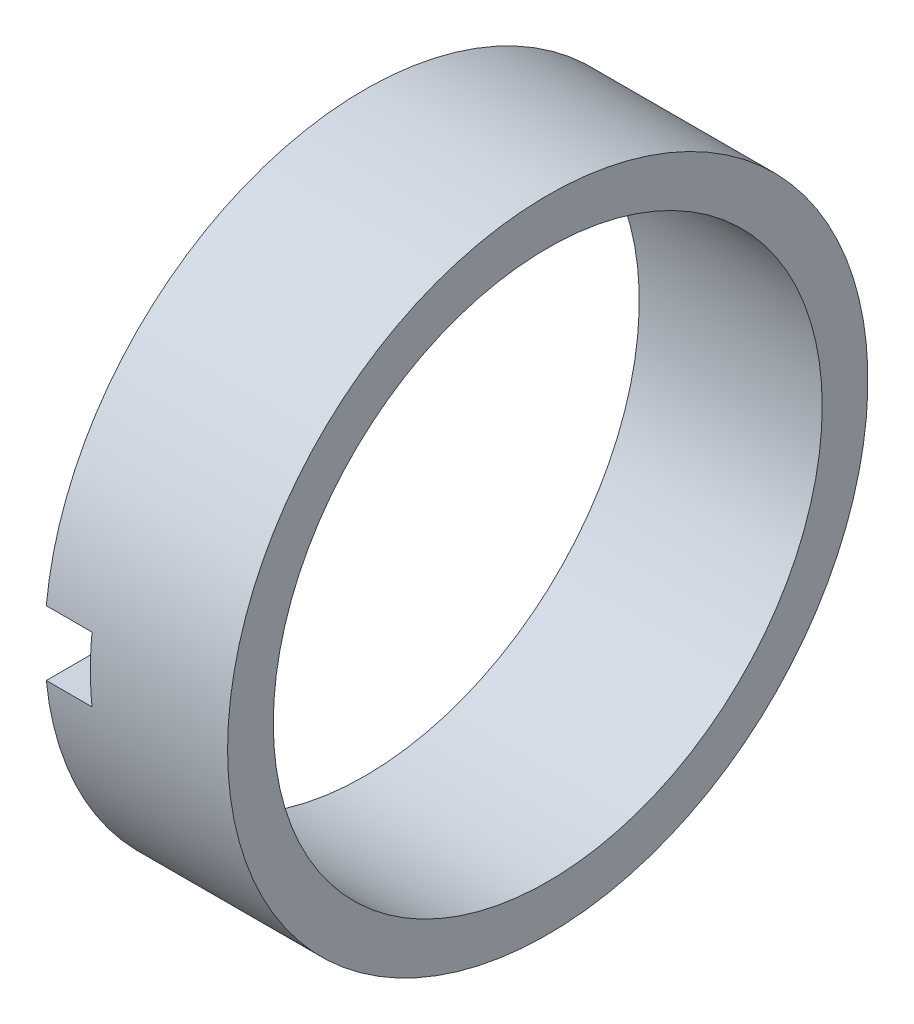
ISO-10303-21;
HEADER;
FILE_DESCRIPTION(('STEP AP214'),'2;1');
FILE_NAME('part.step','',(''),(''),'','','');
FILE_SCHEMA(('AUTOMOTIVE_DESIGN { 1 0 10303 214 1 1 1 1 }'));
ENDSEC;
DATA;
#1=APPLICATION_CONTEXT('core data for automotive mechanical design processes');
#2=APPLICATION_PROTOCOL_DEFINITION('international standard','automotive_design',2000,#1);
#3=PRODUCT_CONTEXT('',#1,'mechanical');
#4=PRODUCT('Part','Part','',(#3));
#5=PRODUCT_RELATED_PRODUCT_CATEGORY('part','',(#4));
#6=PRODUCT_DEFINITION_FORMATION('','',#4);
#7=PRODUCT_DEFINITION_CONTEXT('part definition',#1,'design');
#8=PRODUCT_DEFINITION('design','',#6,#7);
#9=PRODUCT_DEFINITION_SHAPE('','',#8);
#10=(LENGTH_UNIT() NAMED_UNIT(*) SI_UNIT(.MILLI.,.METRE.));
#11=(NAMED_UNIT(*) PLANE_ANGLE_UNIT() SI_UNIT($,.RADIAN.));
#12=(NAMED_UNIT(*) SI_UNIT($,.STERADIAN.) SOLID_ANGLE_UNIT());
#13=UNCERTAINTY_MEASURE_WITH_UNIT(LENGTH_MEASURE(1.E-05),#10,'distance_accuracy_value','');
#14=(GEOMETRIC_REPRESENTATION_CONTEXT(3) GLOBAL_UNCERTAINTY_ASSIGNED_CONTEXT((#13)) GLOBAL_UNIT_ASSIGNED_CONTEXT((#10,
#11,#12)) REPRESENTATION_CONTEXT('',''));
#15=CARTESIAN_POINT('',(0.,0.,0.));
#16=DIRECTION('',(0.,0.,1.));
#17=DIRECTION('',(1.,0.,0.));
#18=AXIS2_PLACEMENT_3D('',#15,#16,#17);
#19=CARTESIAN_POINT('',(0.,114.3254,0.));
#20=DIRECTION('',(1.,0.,0.));
#21=DIRECTION('',(0.,0.,-1.));
#22=AXIS2_PLACEMENT_3D('',#19,#20,#21);
#23=PLANE('',#22);
#24=DIRECTION('',(0.,0.,-1.));
#25=VECTOR('',#24,1.);
#26=CARTESIAN_POINT('',(0.,-13.4874,0.));
#27=LINE('',#26,#25);
#28=CARTESIAN_POINT('',(0.,-13.4874,132.666169543105));
#29=VERTEX_POINT('',#28);
#30=CARTESIAN_POINT('',(0.,-13.4874,113.52703257991));
#31=VERTEX_POINT('',#30);
#32=EDGE_CURVE('E80',#29,#31,#27,.T.);
#33=ORIENTED_EDGE('',*,*,#32,.T.);
#34=CARTESIAN_POINT('',(0.,0.,0.));
#35=DIRECTION('',(-1.,0.,0.));
#36=DIRECTION('',(0.,0.,1.));
#37=AXIS2_PLACEMENT_3D('',#34,#35,#36);
#38=CIRCLE('',#37,114.3254);
#39=CARTESIAN_POINT('',(0.,13.4874,113.52703257991));
#40=VERTEX_POINT('',#39);
#41=EDGE_CURVE('E97',#40,#31,#38,.T.);
#42=ORIENTED_EDGE('',*,*,#41,.F.);
#43=DIRECTION('',(0.,0.,1.));
#44=VECTOR('',#43,1.);
#45=CARTESIAN_POINT('',(0.,13.4874,0.));
#46=LINE('',#45,#44);
#47=CARTESIAN_POINT('',(0.,13.4874,132.666169543105));
#48=VERTEX_POINT('',#47);
#49=EDGE_CURVE('E90',#40,#48,#46,.T.);
#50=ORIENTED_EDGE('',*,*,#49,.T.);
#51=CARTESIAN_POINT('',(0.,0.,0.));
#52=DIRECTION('',(-1.,0.,0.));
#53=DIRECTION('',(0.,0.,1.));
#54=AXIS2_PLACEMENT_3D('',#51,#52,#53);
#55=CIRCLE('',#54,133.35);
#56=EDGE_CURVE('E96',#48,#29,#55,.T.);
#57=ORIENTED_EDGE('',*,*,#56,.T.);
#58=EDGE_LOOP('',(#33,#42,#50,#57));
#59=FACE_BOUND('',#58,.T.);
#60=ADVANCED_FACE('F43',(#59),#23,.F.);
#61=CARTESIAN_POINT('',(-25.4,0.,0.));
#62=DIRECTION('',(-1.,0.,0.));
#63=DIRECTION('',(0.,0.,1.));
#64=AXIS2_PLACEMENT_3D('',#61,#62,#63);
#65=CYLINDRICAL_SURFACE('',#64,133.35);
#66=CARTESIAN_POINT('',(76.2,0.,0.));
#67=DIRECTION('',(-1.,0.,0.));
#68=DIRECTION('',(0.,0.,1.));
#69=AXIS2_PLACEMENT_3D('',#66,#67,#68);
#70=CIRCLE('',#69,133.35);
#71=CARTESIAN_POINT('',(76.2,0.,133.35));
#72=VERTEX_POINT('',#71);
#73=EDGE_CURVE('E102',#72,#72,#70,.T.);
#74=ORIENTED_EDGE('',*,*,#73,.T.);
#75=EDGE_LOOP('',(#74));
#76=FACE_BOUND('',#75,.T.);
#77=DIRECTION('',(-1.,0.,0.));
#78=VECTOR('',#77,1.);
#79=CARTESIAN_POINT('',(-25.4,-13.4874,132.666169543105));
#80=LINE('',#79,#78);
#81=CARTESIAN_POINT('',(19.05,-13.4874,132.666169543105));
#82=VERTEX_POINT('',#81);
#83=EDGE_CURVE('E84',#29,#82,#80,.F.);
#84=ORIENTED_EDGE('',*,*,#83,.F.);
#85=ORIENTED_EDGE('',*,*,#56,.F.);
#86=DIRECTION('',(-1.,0.,0.));
#87=VECTOR('',#86,1.);
#88=CARTESIAN_POINT('',(-25.4,13.4874,132.666169543105));
#89=LINE('',#88,#87);
#90=CARTESIAN_POINT('',(19.05,13.4874,132.666169543105));
#91=VERTEX_POINT('',#90);
#92=EDGE_CURVE('E98',#91,#48,#89,.T.);
#93=ORIENTED_EDGE('',*,*,#92,.F.);
#94=CARTESIAN_POINT('',(19.05,0.,0.));
#95=DIRECTION('',(-1.,0.,0.));
#96=DIRECTION('',(0.,0.,1.));
#97=AXIS2_PLACEMENT_3D('',#94,#95,#96);
#98=CIRCLE('',#97,133.35);
#99=EDGE_CURVE('E62',#82,#91,#98,.T.);
#100=ORIENTED_EDGE('',*,*,#99,.F.);
#101=EDGE_LOOP('',(#84,#85,#93,#100));
#102=FACE_BOUND('',#101,.T.);
#103=ADVANCED_FACE('F94',(#76,#102),#65,.T.);
#104=CARTESIAN_POINT('',(-25.4,0.,0.));
#105=DIRECTION('',(-1.,0.,0.));
#106=DIRECTION('',(0.,0.,1.));
#107=AXIS2_PLACEMENT_3D('',#104,#105,#106);
#108=CYLINDRICAL_SURFACE('',#107,114.3254);
#109=CARTESIAN_POINT('',(76.2,0.,0.));
#110=DIRECTION('',(-1.,0.,0.));
#111=DIRECTION('',(0.,0.,1.));
#112=AXIS2_PLACEMENT_3D('',#109,#110,#111);
#113=CIRCLE('',#112,114.3254);
#114=CARTESIAN_POINT('',(76.2,0.,114.3254));
#115=VERTEX_POINT('',#114);
#116=EDGE_CURVE('E106',#115,#115,#113,.T.);
#117=ORIENTED_EDGE('',*,*,#116,.F.);
#118=EDGE_LOOP('',(#117));
#119=FACE_BOUND('',#118,.T.);
#120=DIRECTION('',(-1.,0.,0.));
#121=VECTOR('',#120,1.);
#122=CARTESIAN_POINT('',(-25.4,-13.4874,113.52703257991));
#123=LINE('',#122,#121);
#124=CARTESIAN_POINT('',(19.05,-13.4874,113.52703257991));
#125=VERTEX_POINT('',#124);
#126=EDGE_CURVE('E11',#125,#31,#123,.T.);
#127=ORIENTED_EDGE('',*,*,#126,.F.);
#128=CARTESIAN_POINT('',(19.05,0.,0.));
#129=DIRECTION('',(-1.,0.,0.));
#130=DIRECTION('',(0.,0.,1.));
#131=AXIS2_PLACEMENT_3D('',#128,#129,#130);
#132=CIRCLE('',#131,114.3254);
#133=CARTESIAN_POINT('',(19.05,13.4874,113.52703257991));
#134=VERTEX_POINT('',#133);
#135=EDGE_CURVE('E101',#134,#125,#132,.F.);
#136=ORIENTED_EDGE('',*,*,#135,.F.);
#137=DIRECTION('',(-1.,0.,0.));
#138=VECTOR('',#137,1.);
#139=CARTESIAN_POINT('',(-25.4,13.4874,113.52703257991));
#140=LINE('',#139,#138);
#141=EDGE_CURVE('E50',#40,#134,#140,.F.);
#142=ORIENTED_EDGE('',*,*,#141,.F.);
#143=ORIENTED_EDGE('',*,*,#41,.T.);
#144=EDGE_LOOP('',(#127,#136,#142,#143));
#145=FACE_BOUND('',#144,.T.);
#146=ADVANCED_FACE('F114',(#119,#145),#108,.F.);
#147=CARTESIAN_POINT('',(76.2,133.35,0.));
#148=DIRECTION('',(-1.,0.,0.));
#149=DIRECTION('',(0.,0.,1.));
#150=AXIS2_PLACEMENT_3D('',#147,#148,#149);
#151=PLANE('',#150);
#152=ORIENTED_EDGE('',*,*,#73,.F.);
#153=EDGE_LOOP('',(#152));
#154=FACE_BOUND('',#153,.T.);
#155=ORIENTED_EDGE('',*,*,#116,.T.);
#156=EDGE_LOOP('',(#155));
#157=FACE_BOUND('',#156,.T.);
#158=ADVANCED_FACE('F126',(#154,#157),#151,.F.);
#159=CARTESIAN_POINT('',(19.05,-13.4874,0.));
#160=DIRECTION('',(0.,1.,0.));
#161=DIRECTION('',(0.,0.,1.));
#162=AXIS2_PLACEMENT_3D('',#159,#160,#161);
#163=PLANE('',#162);
#164=ORIENTED_EDGE('',*,*,#83,.T.);
#165=DIRECTION('',(0.,0.,-1.));
#166=VECTOR('',#165,1.);
#167=CARTESIAN_POINT('',(19.05,-13.4874,0.));
#168=LINE('',#167,#166);
#169=EDGE_CURVE('E116',#82,#125,#168,.T.);
#170=ORIENTED_EDGE('',*,*,#169,.T.);
#171=ORIENTED_EDGE('',*,*,#126,.T.);
#172=ORIENTED_EDGE('',*,*,#32,.F.);
#173=EDGE_LOOP('',(#164,#170,#171,#172));
#174=FACE_BOUND('',#173,.T.);
#175=ADVANCED_FACE('F82',(#174),#163,.T.);
#176=CARTESIAN_POINT('',(19.05,13.4874,0.));
#177=DIRECTION('',(0.,-1.,0.));
#178=DIRECTION('',(0.,0.,-1.));
#179=AXIS2_PLACEMENT_3D('',#176,#177,#178);
#180=PLANE('',#179);
#181=ORIENTED_EDGE('',*,*,#92,.T.);
#182=ORIENTED_EDGE('',*,*,#49,.F.);
#183=ORIENTED_EDGE('',*,*,#141,.T.);
#184=DIRECTION('',(0.,0.,1.));
#185=VECTOR('',#184,1.);
#186=CARTESIAN_POINT('',(19.05,13.4874,0.));
#187=LINE('',#186,#185);
#188=EDGE_CURVE('E57',#134,#91,#187,.T.);
#189=ORIENTED_EDGE('',*,*,#188,.T.);
#190=EDGE_LOOP('',(#181,#182,#183,#189));
#191=FACE_BOUND('',#190,.T.);
#192=ADVANCED_FACE('F112',(#191),#180,.T.);
#193=CARTESIAN_POINT('',(19.05,0.,0.));
#194=DIRECTION('',(-1.,0.,0.));
#195=DIRECTION('',(0.,0.,1.));
#196=AXIS2_PLACEMENT_3D('',#193,#194,#195);
#197=PLANE('',#196);
#198=ORIENTED_EDGE('',*,*,#99,.T.);
#199=ORIENTED_EDGE('',*,*,#188,.F.);
#200=ORIENTED_EDGE('',*,*,#135,.T.);
#201=ORIENTED_EDGE('',*,*,#169,.F.);
#202=EDGE_LOOP('',(#198,#199,#200,#201));
#203=FACE_BOUND('',#202,.T.);
#204=ADVANCED_FACE('F115',(#203),#197,.T.);
#205=CLOSED_SHELL('',(#60,#103,#146,#158,#175,#192,#204));
#206=MANIFOLD_SOLID_BREP('B2',#205);
#207=ADVANCED_BREP_SHAPE_REPRESENTATION('',(#18,#206),#14);
#208=SHAPE_DEFINITION_REPRESENTATION(#9,#207);
ENDSEC;
END-ISO-10303-21;
